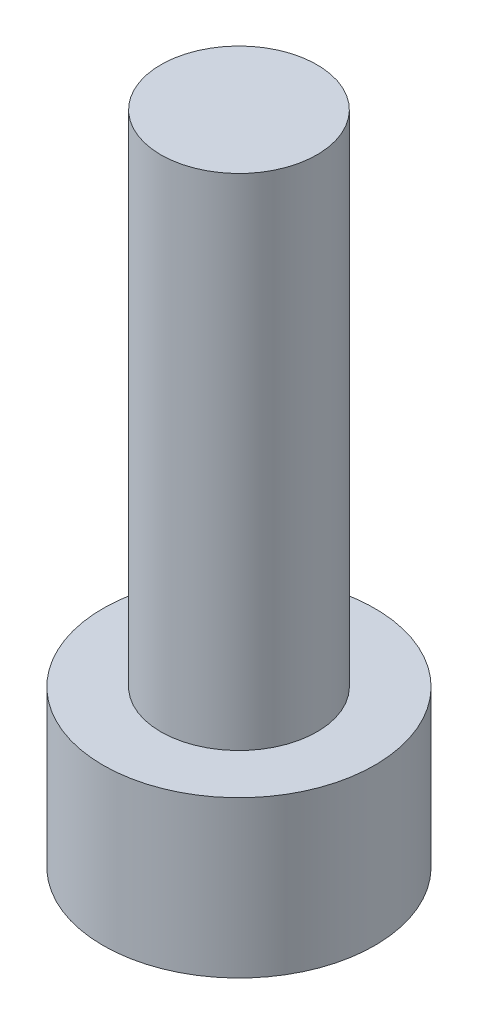
ISO-10303-21;
HEADER;
FILE_DESCRIPTION(('STEP AP214'),'2;1');
FILE_NAME('part.step','',(''),(''),'','','');
FILE_SCHEMA(('AUTOMOTIVE_DESIGN { 1 0 10303 214 1 1 1 1 }'));
ENDSEC;
DATA;
#1=APPLICATION_CONTEXT('core data for automotive mechanical design processes');
#2=APPLICATION_PROTOCOL_DEFINITION('international standard','automotive_design',2000,#1);
#3=PRODUCT_CONTEXT('',#1,'mechanical');
#4=PRODUCT('Part','Part','',(#3));
#5=PRODUCT_RELATED_PRODUCT_CATEGORY('part','',(#4));
#6=PRODUCT_DEFINITION_FORMATION('','',#4);
#7=PRODUCT_DEFINITION_CONTEXT('part definition',#1,'design');
#8=PRODUCT_DEFINITION('design','',#6,#7);
#9=PRODUCT_DEFINITION_SHAPE('','',#8);
#10=(LENGTH_UNIT() NAMED_UNIT(*) SI_UNIT(.MILLI.,.METRE.));
#11=(NAMED_UNIT(*) PLANE_ANGLE_UNIT() SI_UNIT($,.RADIAN.));
#12=(NAMED_UNIT(*) SI_UNIT($,.STERADIAN.) SOLID_ANGLE_UNIT());
#13=UNCERTAINTY_MEASURE_WITH_UNIT(LENGTH_MEASURE(1.E-05),#10,'distance_accuracy_value','');
#14=(GEOMETRIC_REPRESENTATION_CONTEXT(3) GLOBAL_UNCERTAINTY_ASSIGNED_CONTEXT((#13)) GLOBAL_UNIT_ASSIGNED_CONTEXT((#10,
#11,#12)) REPRESENTATION_CONTEXT('',''));
#15=CARTESIAN_POINT('',(0.,0.,0.));
#16=DIRECTION('',(0.,0.,1.));
#17=DIRECTION('',(1.,0.,0.));
#18=AXIS2_PLACEMENT_3D('',#15,#16,#17);
#19=CARTESIAN_POINT('',(0.,5.,0.));
#20=DIRECTION('',(0.,-1.,0.));
#21=DIRECTION('',(0.,0.,-1.));
#22=AXIS2_PLACEMENT_3D('',#19,#20,#21);
#23=CYLINDRICAL_SURFACE('',#22,4.35);
#24=CARTESIAN_POINT('',(0.,5.,0.));
#25=DIRECTION('',(0.,1.,0.));
#26=DIRECTION('',(0.,0.,1.));
#27=AXIS2_PLACEMENT_3D('',#24,#25,#26);
#28=CIRCLE('',#27,4.35);
#29=CARTESIAN_POINT('',(0.,5.,4.35));
#30=VERTEX_POINT('',#29);
#31=EDGE_CURVE('E51',#30,#30,#28,.T.);
#32=ORIENTED_EDGE('',*,*,#31,.F.);
#33=EDGE_LOOP('',(#32));
#34=FACE_BOUND('',#33,.T.);
#35=CARTESIAN_POINT('',(0.,0.,0.));
#36=DIRECTION('',(0.,1.,0.));
#37=DIRECTION('',(0.,0.,1.));
#38=AXIS2_PLACEMENT_3D('',#35,#36,#37);
#39=CIRCLE('',#38,4.35);
#40=CARTESIAN_POINT('',(0.,0.,4.35));
#41=VERTEX_POINT('',#40);
#42=EDGE_CURVE('E46',#41,#41,#39,.T.);
#43=ORIENTED_EDGE('',*,*,#42,.T.);
#44=EDGE_LOOP('',(#43));
#45=FACE_BOUND('',#44,.T.);
#46=ADVANCED_FACE('F43',(#34,#45),#23,.T.);
#47=CARTESIAN_POINT('',(0.,5.,0.));
#48=DIRECTION('',(0.,1.,0.));
#49=DIRECTION('',(0.,0.,1.));
#50=AXIS2_PLACEMENT_3D('',#47,#48,#49);
#51=PLANE('',#50);
#52=CARTESIAN_POINT('',(0.,5.,0.));
#53=DIRECTION('',(0.,1.,0.));
#54=DIRECTION('',(0.,0.,1.));
#55=AXIS2_PLACEMENT_3D('',#52,#53,#54);
#56=CIRCLE('',#55,2.5);
#57=CARTESIAN_POINT('',(0.,5.,2.5));
#58=VERTEX_POINT('',#57);
#59=EDGE_CURVE('E11',#58,#58,#56,.T.);
#60=ORIENTED_EDGE('',*,*,#59,.F.);
#61=EDGE_LOOP('',(#60));
#62=FACE_BOUND('',#61,.T.);
#63=ORIENTED_EDGE('',*,*,#31,.T.);
#64=EDGE_LOOP('',(#63));
#65=FACE_BOUND('',#64,.T.);
#66=ADVANCED_FACE('F162',(#62,#65),#51,.T.);
#67=CARTESIAN_POINT('',(0.,0.,0.));
#68=DIRECTION('',(0.,1.,0.));
#69=DIRECTION('',(0.,0.,1.));
#70=AXIS2_PLACEMENT_3D('',#67,#68,#69);
#71=PLANE('',#70);
#72=DIRECTION('',(0.308424967846728,0.,0.951248673696182));
#73=VECTOR('',#72,1.);
#74=CARTESIAN_POINT('',(1.54635887097014,0.,-1.71525729134299));
#75=LINE('',#74,#73);
#76=CARTESIAN_POINT('',(1.54635887097014,0.,-1.71525729134299));
#77=VERTEX_POINT('',#76);
#78=CARTESIAN_POINT('',(2.25863582381458,0.,0.481557419956074));
#79=VERTEX_POINT('',#78);
#80=EDGE_CURVE('E134',#77,#79,#75,.T.);
#81=ORIENTED_EDGE('',*,*,#80,.F.);
#82=DIRECTION('',(0.978018000660511,0.,0.208520479531426));
#83=VECTOR('',#82,1.);
#84=CARTESIAN_POINT('',(-0.71227695284444,0.,-2.19681471129906));
#85=LINE('',#84,#83);
#86=CARTESIAN_POINT('',(-0.71227695284444,0.,-2.19681471129906));
#87=VERTEX_POINT('',#86);
#88=EDGE_CURVE('E56',#87,#77,#85,.T.);
#89=ORIENTED_EDGE('',*,*,#88,.F.);
#90=DIRECTION('',(0.669593032813783,0.,-0.742728194164756));
#91=VECTOR('',#90,1.);
#92=CARTESIAN_POINT('',(-2.25863582381458,0.,-0.481557419956074));
#93=LINE('',#92,#91);
#94=CARTESIAN_POINT('',(-2.25863582381458,0.,-0.481557419956074));
#95=VERTEX_POINT('',#94);
#96=EDGE_CURVE('E142',#95,#87,#93,.T.);
#97=ORIENTED_EDGE('',*,*,#96,.F.);
#98=DIRECTION('',(-0.308424967846728,0.,-0.951248673696182));
#99=VECTOR('',#98,1.);
#100=CARTESIAN_POINT('',(-1.54635887097014,0.,1.71525729134299));
#101=LINE('',#100,#99);
#102=CARTESIAN_POINT('',(-1.54635887097014,0.,1.71525729134299));
#103=VERTEX_POINT('',#102);
#104=EDGE_CURVE('E139',#103,#95,#101,.T.);
#105=ORIENTED_EDGE('',*,*,#104,.F.);
#106=DIRECTION('',(-0.978018000660512,0.,-0.208520479531426));
#107=VECTOR('',#106,1.);
#108=CARTESIAN_POINT('',(0.71227695284444,0.,2.19681471129906));
#109=LINE('',#108,#107);
#110=CARTESIAN_POINT('',(0.71227695284444,0.,2.19681471129906));
#111=VERTEX_POINT('',#110);
#112=EDGE_CURVE('E110',#111,#103,#109,.T.);
#113=ORIENTED_EDGE('',*,*,#112,.F.);
#114=DIRECTION('',(-0.669593032813784,0.,0.742728194164756));
#115=VECTOR('',#114,1.);
#116=CARTESIAN_POINT('',(2.25863582381458,0.,0.481557419956074));
#117=LINE('',#116,#115);
#118=EDGE_CURVE('E136',#79,#111,#117,.T.);
#119=ORIENTED_EDGE('',*,*,#118,.F.);
#120=EDGE_LOOP('',(#81,#89,#97,#105,#113,#119));
#121=FACE_BOUND('',#120,.T.);
#122=ORIENTED_EDGE('',*,*,#42,.F.);
#123=EDGE_LOOP('',(#122));
#124=FACE_BOUND('',#123,.T.);
#125=ADVANCED_FACE('F159',(#121,#124),#71,.F.);
#126=CARTESIAN_POINT('',(0.,21.,0.));
#127=DIRECTION('',(0.,-1.,0.));
#128=DIRECTION('',(0.,0.,-1.));
#129=AXIS2_PLACEMENT_3D('',#126,#127,#128);
#130=CYLINDRICAL_SURFACE('',#129,2.5);
#131=CARTESIAN_POINT('',(0.,21.,0.));
#132=DIRECTION('',(0.,1.,0.));
#133=DIRECTION('',(0.,0.,1.));
#134=AXIS2_PLACEMENT_3D('',#131,#132,#133);
#135=CIRCLE('',#134,2.5);
#136=CARTESIAN_POINT('',(0.,21.,2.5));
#137=VERTEX_POINT('',#136);
#138=EDGE_CURVE('E148',#137,#137,#135,.T.);
#139=ORIENTED_EDGE('',*,*,#138,.F.);
#140=EDGE_LOOP('',(#139));
#141=FACE_BOUND('',#140,.T.);
#142=ORIENTED_EDGE('',*,*,#59,.T.);
#143=EDGE_LOOP('',(#142));
#144=FACE_BOUND('',#143,.T.);
#145=ADVANCED_FACE('F165',(#141,#144),#130,.T.);
#146=CARTESIAN_POINT('',(0.,21.,0.));
#147=DIRECTION('',(0.,1.,0.));
#148=DIRECTION('',(0.,0.,1.));
#149=AXIS2_PLACEMENT_3D('',#146,#147,#148);
#150=PLANE('',#149);
#151=ORIENTED_EDGE('',*,*,#138,.T.);
#152=EDGE_LOOP('',(#151));
#153=FACE_BOUND('',#152,.T.);
#154=ADVANCED_FACE('F168',(#153),#150,.T.);
#155=CARTESIAN_POINT('',(-0.71227695284444,2.5,-2.19681471129906));
#156=DIRECTION('',(0.208520479531426,0.,-0.978018000660511));
#157=DIRECTION('',(-0.978018000660511,0.,-0.208520479531426));
#158=AXIS2_PLACEMENT_3D('',#155,#156,#157);
#159=PLANE('',#158);
#160=ORIENTED_EDGE('',*,*,#88,.T.);
#161=DIRECTION('',(0.,-1.,0.));
#162=VECTOR('',#161,1.);
#163=CARTESIAN_POINT('',(1.54635887097014,2.5,-1.71525729134299));
#164=LINE('',#163,#162);
#165=CARTESIAN_POINT('',(1.54635887097014,2.5,-1.71525729134299));
#166=VERTEX_POINT('',#165);
#167=EDGE_CURVE('E90',#166,#77,#164,.T.);
#168=ORIENTED_EDGE('',*,*,#167,.F.);
#169=DIRECTION('',(0.978018000660511,0.,0.208520479531426));
#170=VECTOR('',#169,1.);
#171=CARTESIAN_POINT('',(-0.71227695284444,2.5,-2.19681471129906));
#172=LINE('',#171,#170);
#173=CARTESIAN_POINT('',(-0.71227695284444,2.5,-2.19681471129906));
#174=VERTEX_POINT('',#173);
#175=EDGE_CURVE('E145',#174,#166,#172,.T.);
#176=ORIENTED_EDGE('',*,*,#175,.F.);
#177=DIRECTION('',(0.,-1.,0.));
#178=VECTOR('',#177,1.);
#179=CARTESIAN_POINT('',(-0.71227695284444,2.5,-2.19681471129906));
#180=LINE('',#179,#178);
#181=EDGE_CURVE('E70',#174,#87,#180,.T.);
#182=ORIENTED_EDGE('',*,*,#181,.T.);
#183=EDGE_LOOP('',(#160,#168,#176,#182));
#184=FACE_BOUND('',#183,.T.);
#185=ADVANCED_FACE('F196',(#184),#159,.F.);
#186=CARTESIAN_POINT('',(-2.25863582381458,2.5,-0.481557419956074));
#187=DIRECTION('',(-0.742728194164756,0.,-0.669593032813783));
#188=DIRECTION('',(-0.669593032813783,0.,0.742728194164756));
#189=AXIS2_PLACEMENT_3D('',#186,#187,#188);
#190=PLANE('',#189);
#191=ORIENTED_EDGE('',*,*,#96,.T.);
#192=ORIENTED_EDGE('',*,*,#181,.F.);
#193=DIRECTION('',(0.669593032813783,0.,-0.742728194164756));
#194=VECTOR('',#193,1.);
#195=CARTESIAN_POINT('',(-2.25863582381458,2.5,-0.481557419956074));
#196=LINE('',#195,#194);
#197=CARTESIAN_POINT('',(-2.25863582381458,2.5,-0.481557419956074));
#198=VERTEX_POINT('',#197);
#199=EDGE_CURVE('E118',#198,#174,#196,.T.);
#200=ORIENTED_EDGE('',*,*,#199,.F.);
#201=DIRECTION('',(0.,-1.,0.));
#202=VECTOR('',#201,1.);
#203=CARTESIAN_POINT('',(-2.25863582381458,2.5,-0.481557419956074));
#204=LINE('',#203,#202);
#205=EDGE_CURVE('E112',#198,#95,#204,.T.);
#206=ORIENTED_EDGE('',*,*,#205,.T.);
#207=EDGE_LOOP('',(#191,#192,#200,#206));
#208=FACE_BOUND('',#207,.T.);
#209=ADVANCED_FACE('F209',(#208),#190,.F.);
#210=CARTESIAN_POINT('',(-1.54635887097014,2.5,1.71525729134299));
#211=DIRECTION('',(-0.951248673696182,0.,0.308424967846728));
#212=DIRECTION('',(0.308424967846728,0.,0.951248673696182));
#213=AXIS2_PLACEMENT_3D('',#210,#211,#212);
#214=PLANE('',#213);
#215=ORIENTED_EDGE('',*,*,#104,.T.);
#216=ORIENTED_EDGE('',*,*,#205,.F.);
#217=DIRECTION('',(-0.308424967846728,0.,-0.951248673696182));
#218=VECTOR('',#217,1.);
#219=CARTESIAN_POINT('',(-1.54635887097014,2.5,1.71525729134299));
#220=LINE('',#219,#218);
#221=CARTESIAN_POINT('',(-1.54635887097014,2.5,1.71525729134299));
#222=VERTEX_POINT('',#221);
#223=EDGE_CURVE('E113',#222,#198,#220,.T.);
#224=ORIENTED_EDGE('',*,*,#223,.F.);
#225=DIRECTION('',(0.,-1.,0.));
#226=VECTOR('',#225,1.);
#227=CARTESIAN_POINT('',(-1.54635887097014,2.5,1.71525729134299));
#228=LINE('',#227,#226);
#229=EDGE_CURVE('E99',#222,#103,#228,.T.);
#230=ORIENTED_EDGE('',*,*,#229,.T.);
#231=EDGE_LOOP('',(#215,#216,#224,#230));
#232=FACE_BOUND('',#231,.T.);
#233=ADVANCED_FACE('F116',(#232),#214,.F.);
#234=CARTESIAN_POINT('',(0.71227695284444,2.5,2.19681471129906));
#235=DIRECTION('',(-0.208520479531426,0.,0.978018000660512));
#236=DIRECTION('',(0.978018000660512,0.,0.208520479531426));
#237=AXIS2_PLACEMENT_3D('',#234,#235,#236);
#238=PLANE('',#237);
#239=ORIENTED_EDGE('',*,*,#112,.T.);
#240=ORIENTED_EDGE('',*,*,#229,.F.);
#241=DIRECTION('',(-0.978018000660512,0.,-0.208520479531426));
#242=VECTOR('',#241,1.);
#243=CARTESIAN_POINT('',(0.71227695284444,2.5,2.19681471129906));
#244=LINE('',#243,#242);
#245=CARTESIAN_POINT('',(0.71227695284444,2.5,2.19681471129906));
#246=VERTEX_POINT('',#245);
#247=EDGE_CURVE('E102',#246,#222,#244,.T.);
#248=ORIENTED_EDGE('',*,*,#247,.F.);
#249=DIRECTION('',(0.,-1.,0.));
#250=VECTOR('',#249,1.);
#251=CARTESIAN_POINT('',(0.71227695284444,2.5,2.19681471129906));
#252=LINE('',#251,#250);
#253=EDGE_CURVE('E115',#246,#111,#252,.T.);
#254=ORIENTED_EDGE('',*,*,#253,.T.);
#255=EDGE_LOOP('',(#239,#240,#248,#254));
#256=FACE_BOUND('',#255,.T.);
#257=ADVANCED_FACE('F105',(#256),#238,.F.);
#258=CARTESIAN_POINT('',(2.25863582381458,2.5,0.481557419956074));
#259=DIRECTION('',(0.742728194164756,0.,0.669593032813784));
#260=DIRECTION('',(0.669593032813784,0.,-0.742728194164756));
#261=AXIS2_PLACEMENT_3D('',#258,#259,#260);
#262=PLANE('',#261);
#263=ORIENTED_EDGE('',*,*,#118,.T.);
#264=ORIENTED_EDGE('',*,*,#253,.F.);
#265=DIRECTION('',(-0.669593032813784,0.,0.742728194164756));
#266=VECTOR('',#265,1.);
#267=CARTESIAN_POINT('',(2.25863582381458,2.5,0.481557419956074));
#268=LINE('',#267,#266);
#269=CARTESIAN_POINT('',(2.25863582381458,2.5,0.481557419956074));
#270=VERTEX_POINT('',#269);
#271=EDGE_CURVE('E124',#270,#246,#268,.T.);
#272=ORIENTED_EDGE('',*,*,#271,.F.);
#273=DIRECTION('',(0.,-1.,0.));
#274=VECTOR('',#273,1.);
#275=CARTESIAN_POINT('',(2.25863582381458,2.5,0.481557419956074));
#276=LINE('',#275,#274);
#277=EDGE_CURVE('E149',#270,#79,#276,.T.);
#278=ORIENTED_EDGE('',*,*,#277,.T.);
#279=EDGE_LOOP('',(#263,#264,#272,#278));
#280=FACE_BOUND('',#279,.T.);
#281=ADVANCED_FACE('F234',(#280),#262,.F.);
#282=CARTESIAN_POINT('',(1.54635887097014,2.5,-1.71525729134299));
#283=DIRECTION('',(0.951248673696182,0.,-0.308424967846728));
#284=DIRECTION('',(-0.308424967846728,0.,-0.951248673696182));
#285=AXIS2_PLACEMENT_3D('',#282,#283,#284);
#286=PLANE('',#285);
#287=ORIENTED_EDGE('',*,*,#80,.T.);
#288=ORIENTED_EDGE('',*,*,#277,.F.);
#289=DIRECTION('',(0.308424967846728,0.,0.951248673696182));
#290=VECTOR('',#289,1.);
#291=CARTESIAN_POINT('',(1.54635887097014,2.5,-1.71525729134299));
#292=LINE('',#291,#290);
#293=EDGE_CURVE('E130',#166,#270,#292,.T.);
#294=ORIENTED_EDGE('',*,*,#293,.F.);
#295=ORIENTED_EDGE('',*,*,#167,.T.);
#296=EDGE_LOOP('',(#287,#288,#294,#295));
#297=FACE_BOUND('',#296,.T.);
#298=ADVANCED_FACE('F243',(#297),#286,.F.);
#299=CARTESIAN_POINT('',(0.,2.5,0.));
#300=DIRECTION('',(0.,-1.,0.));
#301=DIRECTION('',(0.,0.,-1.));
#302=AXIS2_PLACEMENT_3D('',#299,#300,#301);
#303=PLANE('',#302);
#304=ORIENTED_EDGE('',*,*,#175,.T.);
#305=ORIENTED_EDGE('',*,*,#293,.T.);
#306=ORIENTED_EDGE('',*,*,#271,.T.);
#307=ORIENTED_EDGE('',*,*,#247,.T.);
#308=ORIENTED_EDGE('',*,*,#223,.T.);
#309=ORIENTED_EDGE('',*,*,#199,.T.);
#310=EDGE_LOOP('',(#304,#305,#306,#307,#308,#309));
#311=FACE_BOUND('',#310,.T.);
#312=ADVANCED_FACE('F125',(#311),#303,.T.);
#313=CLOSED_SHELL('',(#46,#66,#125,#145,#154,#185,#209,#233,#257,#281,#298,#312));
#314=MANIFOLD_SOLID_BREP('B2',#313);
#315=ADVANCED_BREP_SHAPE_REPRESENTATION('',(#18,#314),#14);
#316=SHAPE_DEFINITION_REPRESENTATION(#9,#315);
ENDSEC;
END-ISO-10303-21;
